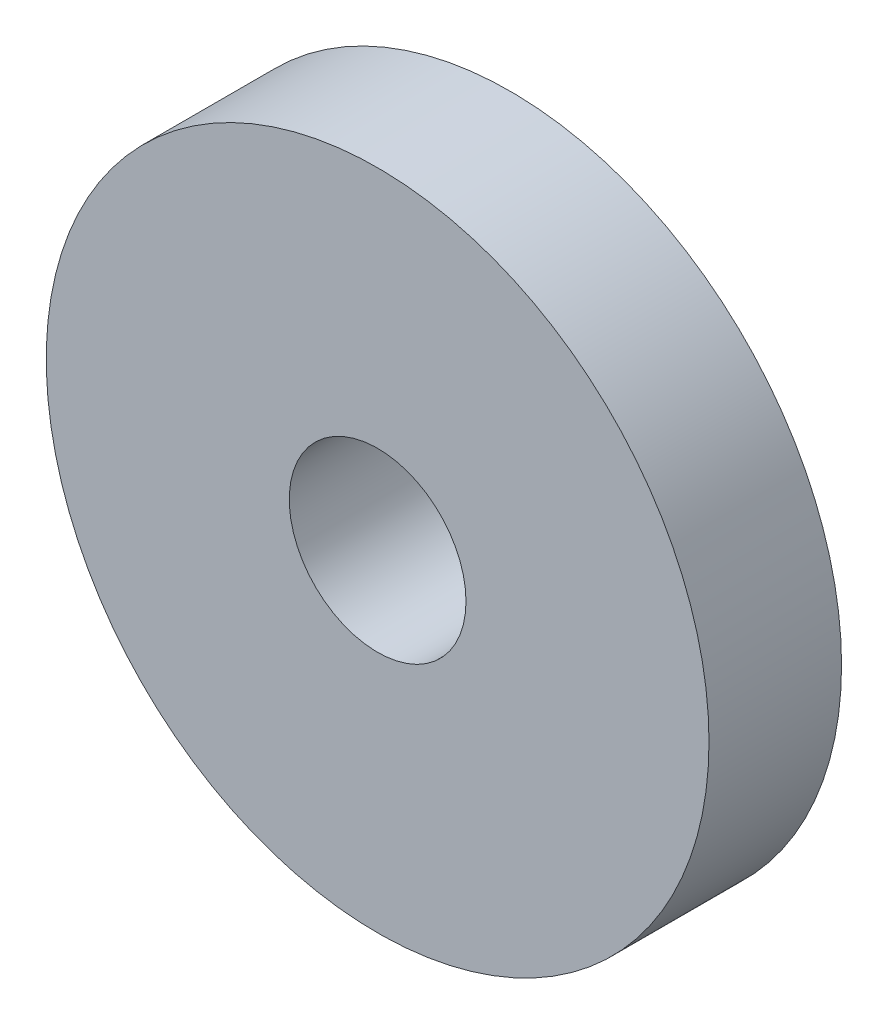
ISO-10303-21;
HEADER;
FILE_DESCRIPTION(('STEP AP214'),'2;1');
FILE_NAME('part.step','',(''),(''),'','','');
FILE_SCHEMA(('AUTOMOTIVE_DESIGN { 1 0 10303 214 1 1 1 1 }'));
ENDSEC;
DATA;
#1=APPLICATION_CONTEXT('core data for automotive mechanical design processes');
#2=APPLICATION_PROTOCOL_DEFINITION('international standard','automotive_design',2000,#1);
#3=PRODUCT_CONTEXT('',#1,'mechanical');
#4=PRODUCT('Part','Part','',(#3));
#5=PRODUCT_RELATED_PRODUCT_CATEGORY('part','',(#4));
#6=PRODUCT_DEFINITION_FORMATION('','',#4);
#7=PRODUCT_DEFINITION_CONTEXT('part definition',#1,'design');
#8=PRODUCT_DEFINITION('design','',#6,#7);
#9=PRODUCT_DEFINITION_SHAPE('','',#8);
#10=(LENGTH_UNIT() NAMED_UNIT(*) SI_UNIT(.MILLI.,.METRE.));
#11=(NAMED_UNIT(*) PLANE_ANGLE_UNIT() SI_UNIT($,.RADIAN.));
#12=(NAMED_UNIT(*) SI_UNIT($,.STERADIAN.) SOLID_ANGLE_UNIT());
#13=UNCERTAINTY_MEASURE_WITH_UNIT(LENGTH_MEASURE(1.E-05),#10,'distance_accuracy_value','');
#14=(GEOMETRIC_REPRESENTATION_CONTEXT(3) GLOBAL_UNCERTAINTY_ASSIGNED_CONTEXT((#13)) GLOBAL_UNIT_ASSIGNED_CONTEXT((#10,
#11,#12)) REPRESENTATION_CONTEXT('',''));
#15=CARTESIAN_POINT('',(0.,0.,0.));
#16=DIRECTION('',(0.,0.,1.));
#17=DIRECTION('',(1.,0.,0.));
#18=AXIS2_PLACEMENT_3D('',#15,#16,#17);
#19=CARTESIAN_POINT('',(0.,0.,3.));
#20=DIRECTION('',(0.,0.,1.));
#21=DIRECTION('',(1.,0.,0.));
#22=AXIS2_PLACEMENT_3D('',#19,#20,#21);
#23=PLANE('',#22);
#24=CARTESIAN_POINT('',(0.,0.,3.));
#25=DIRECTION('',(0.,0.,1.));
#26=DIRECTION('',(1.,0.,0.));
#27=AXIS2_PLACEMENT_3D('',#24,#25,#26);
#28=CIRCLE('',#27,7.5);
#29=CARTESIAN_POINT('',(7.5,0.,3.));
#30=VERTEX_POINT('',#29);
#31=EDGE_CURVE('E10',#30,#30,#28,.T.);
#32=ORIENTED_EDGE('',*,*,#31,.T.);
#33=EDGE_LOOP('',(#32));
#34=FACE_BOUND('',#33,.T.);
#35=CARTESIAN_POINT('',(0.,0.,3.));
#36=DIRECTION('',(0.,0.,1.));
#37=DIRECTION('',(1.,0.,0.));
#38=AXIS2_PLACEMENT_3D('',#35,#36,#37);
#39=CIRCLE('',#38,2.);
#40=CARTESIAN_POINT('',(2.,0.,3.));
#41=VERTEX_POINT('',#40);
#42=EDGE_CURVE('E50',#41,#41,#39,.T.);
#43=ORIENTED_EDGE('',*,*,#42,.F.);
#44=EDGE_LOOP('',(#43));
#45=FACE_BOUND('',#44,.T.);
#46=ADVANCED_FACE('F37',(#34,#45),#23,.T.);
#47=CARTESIAN_POINT('',(0.,0.,0.));
#48=DIRECTION('',(0.,0.,1.));
#49=DIRECTION('',(1.,0.,0.));
#50=AXIS2_PLACEMENT_3D('',#47,#48,#49);
#51=PLANE('',#50);
#52=CARTESIAN_POINT('',(0.,0.,0.));
#53=DIRECTION('',(0.,0.,1.));
#54=DIRECTION('',(1.,0.,0.));
#55=AXIS2_PLACEMENT_3D('',#52,#53,#54);
#56=CIRCLE('',#55,7.5);
#57=CARTESIAN_POINT('',(7.5,0.,0.));
#58=VERTEX_POINT('',#57);
#59=EDGE_CURVE('E41',#58,#58,#56,.T.);
#60=ORIENTED_EDGE('',*,*,#59,.F.);
#61=EDGE_LOOP('',(#60));
#62=FACE_BOUND('',#61,.T.);
#63=CARTESIAN_POINT('',(0.,0.,0.));
#64=DIRECTION('',(0.,0.,1.));
#65=DIRECTION('',(1.,0.,0.));
#66=AXIS2_PLACEMENT_3D('',#63,#64,#65);
#67=CIRCLE('',#66,2.);
#68=CARTESIAN_POINT('',(2.,0.,0.));
#69=VERTEX_POINT('',#68);
#70=EDGE_CURVE('E52',#69,#69,#67,.T.);
#71=ORIENTED_EDGE('',*,*,#70,.T.);
#72=EDGE_LOOP('',(#71));
#73=FACE_BOUND('',#72,.T.);
#74=ADVANCED_FACE('F64',(#62,#73),#51,.F.);
#75=CARTESIAN_POINT('',(0.,0.,3.));
#76=DIRECTION('',(0.,0.,-1.));
#77=DIRECTION('',(-1.,0.,0.));
#78=AXIS2_PLACEMENT_3D('',#75,#76,#77);
#79=CYLINDRICAL_SURFACE('',#78,7.5);
#80=ORIENTED_EDGE('',*,*,#31,.F.);
#81=EDGE_LOOP('',(#80));
#82=FACE_BOUND('',#81,.T.);
#83=ORIENTED_EDGE('',*,*,#59,.T.);
#84=EDGE_LOOP('',(#83));
#85=FACE_BOUND('',#84,.T.);
#86=ADVANCED_FACE('F39',(#82,#85),#79,.T.);
#87=CARTESIAN_POINT('',(0.,0.,3.));
#88=DIRECTION('',(0.,0.,-1.));
#89=DIRECTION('',(-1.,0.,0.));
#90=AXIS2_PLACEMENT_3D('',#87,#88,#89);
#91=CYLINDRICAL_SURFACE('',#90,2.);
#92=ORIENTED_EDGE('',*,*,#42,.T.);
#93=EDGE_LOOP('',(#92));
#94=FACE_BOUND('',#93,.T.);
#95=ORIENTED_EDGE('',*,*,#70,.F.);
#96=EDGE_LOOP('',(#95));
#97=FACE_BOUND('',#96,.T.);
#98=ADVANCED_FACE('F60',(#94,#97),#91,.F.);
#99=CLOSED_SHELL('',(#46,#74,#86,#98));
#100=MANIFOLD_SOLID_BREP('B2',#99);
#101=ADVANCED_BREP_SHAPE_REPRESENTATION('',(#18,#100),#14);
#102=SHAPE_DEFINITION_REPRESENTATION(#9,#101);
ENDSEC;
END-ISO-10303-21;
